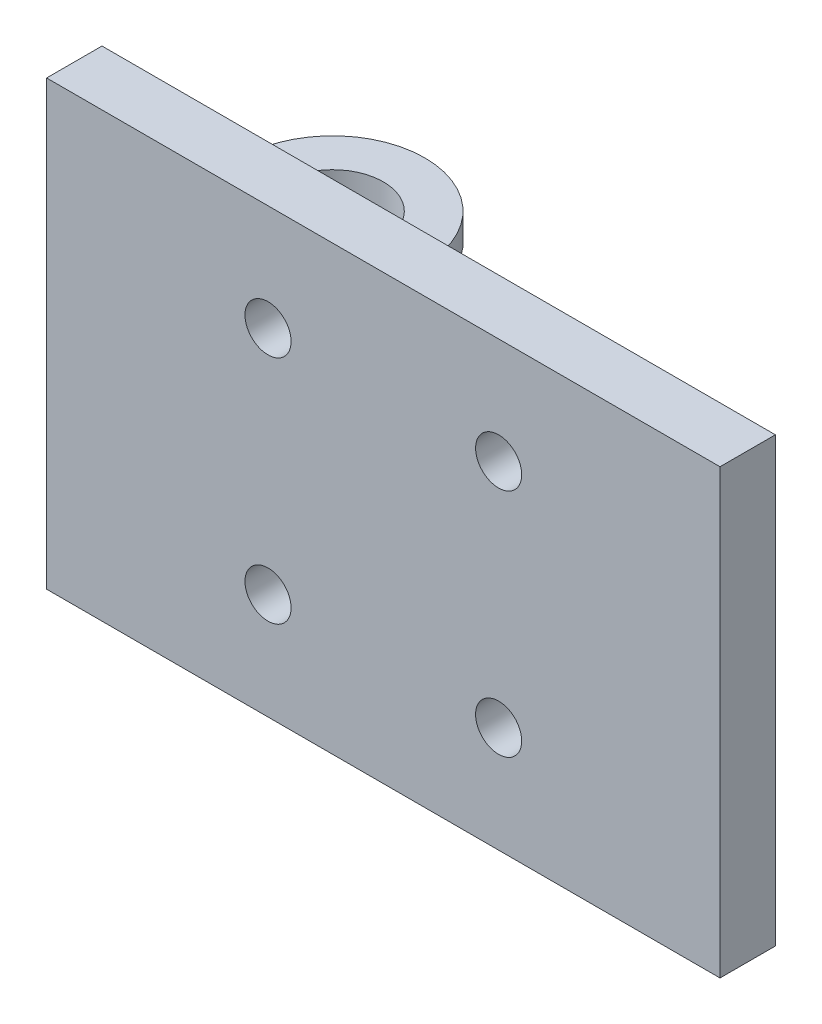
ISO-10303-21;
HEADER;
FILE_DESCRIPTION(('STEP AP214'),'2;1');
FILE_NAME('part.step','',(''),(''),'','','');
FILE_SCHEMA(('AUTOMOTIVE_DESIGN { 1 0 10303 214 1 1 1 1 }'));
ENDSEC;
DATA;
#1=APPLICATION_CONTEXT('core data for automotive mechanical design processes');
#2=APPLICATION_PROTOCOL_DEFINITION('international standard','automotive_design',2000,#1);
#3=PRODUCT_CONTEXT('',#1,'mechanical');
#4=PRODUCT('Part','Part','',(#3));
#5=PRODUCT_RELATED_PRODUCT_CATEGORY('part','',(#4));
#6=PRODUCT_DEFINITION_FORMATION('','',#4);
#7=PRODUCT_DEFINITION_CONTEXT('part definition',#1,'design');
#8=PRODUCT_DEFINITION('design','',#6,#7);
#9=PRODUCT_DEFINITION_SHAPE('','',#8);
#10=(LENGTH_UNIT() NAMED_UNIT(*) SI_UNIT(.MILLI.,.METRE.));
#11=(NAMED_UNIT(*) PLANE_ANGLE_UNIT() SI_UNIT($,.RADIAN.));
#12=(NAMED_UNIT(*) SI_UNIT($,.STERADIAN.) SOLID_ANGLE_UNIT());
#13=UNCERTAINTY_MEASURE_WITH_UNIT(LENGTH_MEASURE(1.E-05),#10,'distance_accuracy_value','');
#14=(GEOMETRIC_REPRESENTATION_CONTEXT(3) GLOBAL_UNCERTAINTY_ASSIGNED_CONTEXT((#13)) GLOBAL_UNIT_ASSIGNED_CONTEXT((#10,
#11,#12)) REPRESENTATION_CONTEXT('',''));
#15=CARTESIAN_POINT('',(0.,0.,0.));
#16=DIRECTION('',(0.,0.,1.));
#17=DIRECTION('',(1.,0.,0.));
#18=AXIS2_PLACEMENT_3D('',#15,#16,#17);
#19=CARTESIAN_POINT('',(0.,0.,1.8));
#20=DIRECTION('',(0.,0.,1.));
#21=DIRECTION('',(1.,0.,0.));
#22=AXIS2_PLACEMENT_3D('',#19,#20,#21);
#23=PLANE('',#22);
#24=CARTESIAN_POINT('',(3.75,-3.75,1.8));
#25=DIRECTION('',(0.,0.,1.));
#26=DIRECTION('',(1.,0.,0.));
#27=AXIS2_PLACEMENT_3D('',#24,#25,#26);
#28=CIRCLE('',#27,0.75);
#29=CARTESIAN_POINT('',(4.5,-3.75,1.8));
#30=VERTEX_POINT('',#29);
#31=EDGE_CURVE('E152',#30,#30,#28,.T.);
#32=ORIENTED_EDGE('',*,*,#31,.F.);
#33=EDGE_LOOP('',(#32));
#34=FACE_BOUND('',#33,.T.);
#35=CARTESIAN_POINT('',(-3.75,3.75,1.8));
#36=DIRECTION('',(0.,0.,1.));
#37=DIRECTION('',(1.,0.,0.));
#38=AXIS2_PLACEMENT_3D('',#35,#36,#37);
#39=CIRCLE('',#38,0.75);
#40=CARTESIAN_POINT('',(-3.,3.75,1.8));
#41=VERTEX_POINT('',#40);
#42=EDGE_CURVE('E122',#41,#41,#39,.T.);
#43=ORIENTED_EDGE('',*,*,#42,.F.);
#44=EDGE_LOOP('',(#43));
#45=FACE_BOUND('',#44,.T.);
#46=DIRECTION('',(0.,-1.,0.));
#47=VECTOR('',#46,1.);
#48=CARTESIAN_POINT('',(-10.95,-7.2,1.8));
#49=LINE('',#48,#47);
#50=CARTESIAN_POINT('',(-10.95,7.2,1.8));
#51=VERTEX_POINT('',#50);
#52=CARTESIAN_POINT('',(-10.95,-7.2,1.8));
#53=VERTEX_POINT('',#52);
#54=EDGE_CURVE('E102',#51,#53,#49,.T.);
#55=ORIENTED_EDGE('',*,*,#54,.T.);
#56=DIRECTION('',(1.,0.,0.));
#57=VECTOR('',#56,1.);
#58=CARTESIAN_POINT('',(10.95,-7.2,1.8));
#59=LINE('',#58,#57);
#60=CARTESIAN_POINT('',(10.95,-7.2,1.8));
#61=VERTEX_POINT('',#60);
#62=EDGE_CURVE('E97',#53,#61,#59,.T.);
#63=ORIENTED_EDGE('',*,*,#62,.T.);
#64=DIRECTION('',(0.,1.,0.));
#65=VECTOR('',#64,1.);
#66=CARTESIAN_POINT('',(10.95,-7.2,1.8));
#67=LINE('',#66,#65);
#68=CARTESIAN_POINT('',(10.95,7.2,1.8));
#69=VERTEX_POINT('',#68);
#70=EDGE_CURVE('E100',#61,#69,#67,.T.);
#71=ORIENTED_EDGE('',*,*,#70,.T.);
#72=DIRECTION('',(-1.,0.,0.));
#73=VECTOR('',#72,1.);
#74=CARTESIAN_POINT('',(10.95,7.2,1.8));
#75=LINE('',#74,#73);
#76=EDGE_CURVE('E67',#69,#51,#75,.T.);
#77=ORIENTED_EDGE('',*,*,#76,.T.);
#78=EDGE_LOOP('',(#55,#63,#71,#77));
#79=FACE_BOUND('',#78,.T.);
#80=CARTESIAN_POINT('',(3.75,3.75,1.8));
#81=DIRECTION('',(0.,0.,1.));
#82=DIRECTION('',(1.,0.,0.));
#83=AXIS2_PLACEMENT_3D('',#80,#81,#82);
#84=CIRCLE('',#83,0.75);
#85=CARTESIAN_POINT('',(4.5,3.75,1.8));
#86=VERTEX_POINT('',#85);
#87=EDGE_CURVE('E144',#86,#86,#84,.T.);
#88=ORIENTED_EDGE('',*,*,#87,.F.);
#89=EDGE_LOOP('',(#88));
#90=FACE_BOUND('',#89,.T.);
#91=CARTESIAN_POINT('',(-3.75,-3.75,1.8));
#92=DIRECTION('',(0.,0.,1.));
#93=DIRECTION('',(1.,0.,0.));
#94=AXIS2_PLACEMENT_3D('',#91,#92,#93);
#95=CIRCLE('',#94,0.75);
#96=CARTESIAN_POINT('',(-3.,-3.75,1.8));
#97=VERTEX_POINT('',#96);
#98=EDGE_CURVE('E160',#97,#97,#95,.T.);
#99=ORIENTED_EDGE('',*,*,#98,.F.);
#100=EDGE_LOOP('',(#99));
#101=FACE_BOUND('',#100,.T.);
#102=ADVANCED_FACE('F49',(#34,#45,#79,#90,#101),#23,.T.);
#103=CARTESIAN_POINT('',(0.,0.,0.));
#104=DIRECTION('',(0.,0.,1.));
#105=DIRECTION('',(1.,0.,0.));
#106=AXIS2_PLACEMENT_3D('',#103,#104,#105);
#107=PLANE('',#106);
#108=DIRECTION('',(0.,-1.,0.));
#109=VECTOR('',#108,1.);
#110=CARTESIAN_POINT('',(-10.95,-7.2,0.));
#111=LINE('',#110,#109);
#112=CARTESIAN_POINT('',(-10.95,7.2,0.));
#113=VERTEX_POINT('',#112);
#114=CARTESIAN_POINT('',(-10.95,-7.2,0.));
#115=VERTEX_POINT('',#114);
#116=EDGE_CURVE('E118',#113,#115,#111,.T.);
#117=ORIENTED_EDGE('',*,*,#116,.F.);
#118=DIRECTION('',(-1.,0.,0.));
#119=VECTOR('',#118,1.);
#120=CARTESIAN_POINT('',(10.95,7.2,0.));
#121=LINE('',#120,#119);
#122=CARTESIAN_POINT('',(10.95,7.2,0.));
#123=VERTEX_POINT('',#122);
#124=EDGE_CURVE('E90',#123,#113,#121,.T.);
#125=ORIENTED_EDGE('',*,*,#124,.F.);
#126=DIRECTION('',(0.,1.,0.));
#127=VECTOR('',#126,1.);
#128=CARTESIAN_POINT('',(10.95,-7.2,0.));
#129=LINE('',#128,#127);
#130=CARTESIAN_POINT('',(10.95,-7.2,0.));
#131=VERTEX_POINT('',#130);
#132=EDGE_CURVE('E84',#131,#123,#129,.T.);
#133=ORIENTED_EDGE('',*,*,#132,.F.);
#134=DIRECTION('',(1.,0.,0.));
#135=VECTOR('',#134,1.);
#136=CARTESIAN_POINT('',(10.95,-7.2,0.));
#137=LINE('',#136,#135);
#138=EDGE_CURVE('E107',#115,#131,#137,.T.);
#139=ORIENTED_EDGE('',*,*,#138,.F.);
#140=EDGE_LOOP('',(#117,#125,#133,#139));
#141=FACE_BOUND('',#140,.T.);
#142=CARTESIAN_POINT('',(-3.75,3.75,0.));
#143=DIRECTION('',(0.,0.,1.));
#144=DIRECTION('',(1.,0.,0.));
#145=AXIS2_PLACEMENT_3D('',#142,#143,#144);
#146=CIRCLE('',#145,0.75);
#147=CARTESIAN_POINT('',(-3.,3.75,0.));
#148=VERTEX_POINT('',#147);
#149=EDGE_CURVE('E140',#148,#148,#146,.T.);
#150=ORIENTED_EDGE('',*,*,#149,.T.);
#151=EDGE_LOOP('',(#150));
#152=FACE_BOUND('',#151,.T.);
#153=CARTESIAN_POINT('',(3.75,3.75,0.));
#154=DIRECTION('',(0.,0.,1.));
#155=DIRECTION('',(1.,0.,0.));
#156=AXIS2_PLACEMENT_3D('',#153,#154,#155);
#157=CIRCLE('',#156,0.75);
#158=CARTESIAN_POINT('',(4.5,3.75,0.));
#159=VERTEX_POINT('',#158);
#160=EDGE_CURVE('E148',#159,#159,#157,.T.);
#161=ORIENTED_EDGE('',*,*,#160,.T.);
#162=EDGE_LOOP('',(#161));
#163=FACE_BOUND('',#162,.T.);
#164=CARTESIAN_POINT('',(3.75,-3.75,0.));
#165=DIRECTION('',(0.,0.,1.));
#166=DIRECTION('',(1.,0.,0.));
#167=AXIS2_PLACEMENT_3D('',#164,#165,#166);
#168=CIRCLE('',#167,0.75);
#169=CARTESIAN_POINT('',(4.5,-3.75,0.));
#170=VERTEX_POINT('',#169);
#171=EDGE_CURVE('E156',#170,#170,#168,.T.);
#172=ORIENTED_EDGE('',*,*,#171,.T.);
#173=EDGE_LOOP('',(#172));
#174=FACE_BOUND('',#173,.T.);
#175=CARTESIAN_POINT('',(-3.75,-3.75,0.));
#176=DIRECTION('',(0.,0.,1.));
#177=DIRECTION('',(1.,0.,0.));
#178=AXIS2_PLACEMENT_3D('',#175,#176,#177);
#179=CIRCLE('',#178,0.75);
#180=CARTESIAN_POINT('',(-3.,-3.75,0.));
#181=VERTEX_POINT('',#180);
#182=EDGE_CURVE('E164',#181,#181,#179,.T.);
#183=ORIENTED_EDGE('',*,*,#182,.T.);
#184=EDGE_LOOP('',(#183));
#185=FACE_BOUND('',#184,.T.);
#186=ADVANCED_FACE('F135',(#141,#152,#163,#174,#185),#107,.F.);
#187=CARTESIAN_POINT('',(-10.95,-7.2,1.8));
#188=DIRECTION('',(1.,0.,0.));
#189=DIRECTION('',(0.,0.,-1.));
#190=AXIS2_PLACEMENT_3D('',#187,#188,#189);
#191=PLANE('',#190);
#192=ORIENTED_EDGE('',*,*,#116,.T.);
#193=DIRECTION('',(0.,0.,-1.));
#194=VECTOR('',#193,1.);
#195=CARTESIAN_POINT('',(-10.95,-7.2,1.8));
#196=LINE('',#195,#194);
#197=EDGE_CURVE('E12',#53,#115,#196,.T.);
#198=ORIENTED_EDGE('',*,*,#197,.F.);
#199=ORIENTED_EDGE('',*,*,#54,.F.);
#200=DIRECTION('',(0.,0.,-1.));
#201=VECTOR('',#200,1.);
#202=CARTESIAN_POINT('',(-10.95,7.2,1.8));
#203=LINE('',#202,#201);
#204=EDGE_CURVE('E114',#51,#113,#203,.T.);
#205=ORIENTED_EDGE('',*,*,#204,.T.);
#206=EDGE_LOOP('',(#192,#198,#199,#205));
#207=FACE_BOUND('',#206,.T.);
#208=ADVANCED_FACE('F51',(#207),#191,.F.);
#209=CARTESIAN_POINT('',(10.95,-7.2,1.8));
#210=DIRECTION('',(0.,1.,0.));
#211=DIRECTION('',(-1.,0.,0.));
#212=AXIS2_PLACEMENT_3D('',#209,#210,#211);
#213=PLANE('',#212);
#214=ORIENTED_EDGE('',*,*,#138,.T.);
#215=DIRECTION('',(0.,0.,-1.));
#216=VECTOR('',#215,1.);
#217=CARTESIAN_POINT('',(10.95,-7.2,1.8));
#218=LINE('',#217,#216);
#219=EDGE_CURVE('E59',#61,#131,#218,.T.);
#220=ORIENTED_EDGE('',*,*,#219,.F.);
#221=ORIENTED_EDGE('',*,*,#62,.F.);
#222=ORIENTED_EDGE('',*,*,#197,.T.);
#223=EDGE_LOOP('',(#214,#220,#221,#222));
#224=FACE_BOUND('',#223,.T.);
#225=ADVANCED_FACE('F106',(#224),#213,.F.);
#226=CARTESIAN_POINT('',(10.95,-7.2,1.8));
#227=DIRECTION('',(-1.,0.,0.));
#228=DIRECTION('',(0.,0.,1.));
#229=AXIS2_PLACEMENT_3D('',#226,#227,#228);
#230=PLANE('',#229);
#231=ORIENTED_EDGE('',*,*,#132,.T.);
#232=DIRECTION('',(0.,0.,-1.));
#233=VECTOR('',#232,1.);
#234=CARTESIAN_POINT('',(10.95,7.2,1.8));
#235=LINE('',#234,#233);
#236=EDGE_CURVE('E109',#69,#123,#235,.T.);
#237=ORIENTED_EDGE('',*,*,#236,.F.);
#238=ORIENTED_EDGE('',*,*,#70,.F.);
#239=ORIENTED_EDGE('',*,*,#219,.T.);
#240=EDGE_LOOP('',(#231,#237,#238,#239));
#241=FACE_BOUND('',#240,.T.);
#242=ADVANCED_FACE('F110',(#241),#230,.F.);
#243=CARTESIAN_POINT('',(10.95,7.2,1.8));
#244=DIRECTION('',(0.,-1.,0.));
#245=DIRECTION('',(1.,0.,0.));
#246=AXIS2_PLACEMENT_3D('',#243,#244,#245);
#247=PLANE('',#246);
#248=ORIENTED_EDGE('',*,*,#124,.T.);
#249=ORIENTED_EDGE('',*,*,#204,.F.);
#250=ORIENTED_EDGE('',*,*,#76,.F.);
#251=ORIENTED_EDGE('',*,*,#236,.T.);
#252=EDGE_LOOP('',(#248,#249,#250,#251));
#253=FACE_BOUND('',#252,.T.);
#254=ADVANCED_FACE('F132',(#253),#247,.F.);
#255=CARTESIAN_POINT('',(-3.75,3.75,1.8));
#256=DIRECTION('',(0.,0.,-1.));
#257=DIRECTION('',(-1.,0.,0.));
#258=AXIS2_PLACEMENT_3D('',#255,#256,#257);
#259=CYLINDRICAL_SURFACE('',#258,0.75);
#260=ORIENTED_EDGE('',*,*,#42,.T.);
#261=EDGE_LOOP('',(#260));
#262=FACE_BOUND('',#261,.T.);
#263=ORIENTED_EDGE('',*,*,#149,.F.);
#264=EDGE_LOOP('',(#263));
#265=FACE_BOUND('',#264,.T.);
#266=ADVANCED_FACE('F185',(#262,#265),#259,.F.);
#267=CARTESIAN_POINT('',(3.75,3.75,1.8));
#268=DIRECTION('',(0.,0.,-1.));
#269=DIRECTION('',(-1.,0.,0.));
#270=AXIS2_PLACEMENT_3D('',#267,#268,#269);
#271=CYLINDRICAL_SURFACE('',#270,0.75);
#272=ORIENTED_EDGE('',*,*,#87,.T.);
#273=EDGE_LOOP('',(#272));
#274=FACE_BOUND('',#273,.T.);
#275=ORIENTED_EDGE('',*,*,#160,.F.);
#276=EDGE_LOOP('',(#275));
#277=FACE_BOUND('',#276,.T.);
#278=ADVANCED_FACE('F231',(#274,#277),#271,.F.);
#279=CARTESIAN_POINT('',(3.75,-3.75,1.8));
#280=DIRECTION('',(0.,0.,-1.));
#281=DIRECTION('',(-1.,0.,0.));
#282=AXIS2_PLACEMENT_3D('',#279,#280,#281);
#283=CYLINDRICAL_SURFACE('',#282,0.75);
#284=ORIENTED_EDGE('',*,*,#31,.T.);
#285=EDGE_LOOP('',(#284));
#286=FACE_BOUND('',#285,.T.);
#287=ORIENTED_EDGE('',*,*,#171,.F.);
#288=EDGE_LOOP('',(#287));
#289=FACE_BOUND('',#288,.T.);
#290=ADVANCED_FACE('F239',(#286,#289),#283,.F.);
#291=CARTESIAN_POINT('',(-3.75,-3.75,1.8));
#292=DIRECTION('',(0.,0.,-1.));
#293=DIRECTION('',(-1.,0.,0.));
#294=AXIS2_PLACEMENT_3D('',#291,#292,#293);
#295=CYLINDRICAL_SURFACE('',#294,0.75);
#296=ORIENTED_EDGE('',*,*,#98,.T.);
#297=EDGE_LOOP('',(#296));
#298=FACE_BOUND('',#297,.T.);
#299=ORIENTED_EDGE('',*,*,#182,.F.);
#300=EDGE_LOOP('',(#299));
#301=FACE_BOUND('',#300,.T.);
#302=ADVANCED_FACE('F172',(#298,#301),#295,.F.);
#303=CLOSED_SHELL('',(#102,#186,#208,#225,#242,#254,#266,#278,#290,#302));
#304=MANIFOLD_SOLID_BREP('B2',#303);
#305=CARTESIAN_POINT('',(-7.95,1.8,-4.5));
#306=DIRECTION('',(0.,1.,0.));
#307=DIRECTION('',(0.,0.,1.));
#308=AXIS2_PLACEMENT_3D('',#305,#306,#307);
#309=PLANE('',#308);
#310=DIRECTION('',(0.,0.,1.));
#311=VECTOR('',#310,1.);
#312=CARTESIAN_POINT('',(-10.95,1.8,0.));
#313=LINE('',#312,#311);
#314=CARTESIAN_POINT('',(-10.95,1.8,-4.5));
#315=VERTEX_POINT('',#314);
#316=CARTESIAN_POINT('',(-10.95,1.8,0.));
#317=VERTEX_POINT('',#316);
#318=EDGE_CURVE('E337',#315,#317,#313,.T.);
#319=ORIENTED_EDGE('',*,*,#318,.T.);
#320=DIRECTION('',(1.,0.,0.));
#321=VECTOR('',#320,1.);
#322=CARTESIAN_POINT('',(-10.95,1.8,0.));
#323=LINE('',#322,#321);
#324=CARTESIAN_POINT('',(-4.95,1.8,0.));
#325=VERTEX_POINT('',#324);
#326=EDGE_CURVE('E332',#317,#325,#323,.T.);
#327=ORIENTED_EDGE('',*,*,#326,.T.);
#328=DIRECTION('',(0.,0.,-1.));
#329=VECTOR('',#328,1.);
#330=CARTESIAN_POINT('',(-4.95,1.8,0.));
#331=LINE('',#330,#329);
#332=CARTESIAN_POINT('',(-4.95,1.8,-4.5));
#333=VERTEX_POINT('',#332);
#334=EDGE_CURVE('E335',#325,#333,#331,.T.);
#335=ORIENTED_EDGE('',*,*,#334,.T.);
#336=CARTESIAN_POINT('',(-7.95,1.8,-4.5));
#337=DIRECTION('',(0.,1.,0.));
#338=DIRECTION('',(0.,0.,1.));
#339=AXIS2_PLACEMENT_3D('',#336,#337,#338);
#340=CIRCLE('',#339,3.);
#341=EDGE_CURVE('E302',#333,#315,#340,.T.);
#342=ORIENTED_EDGE('',*,*,#341,.T.);
#343=EDGE_LOOP('',(#319,#327,#335,#342));
#344=FACE_BOUND('',#343,.T.);
#345=CARTESIAN_POINT('',(-7.95,1.8,-4.5));
#346=DIRECTION('',(0.,1.,0.));
#347=DIRECTION('',(0.,0.,1.));
#348=AXIS2_PLACEMENT_3D('',#345,#346,#347);
#349=CIRCLE('',#348,1.65);
#350=CARTESIAN_POINT('',(-7.95,1.8,-2.85));
#351=VERTEX_POINT('',#350);
#352=EDGE_CURVE('E352',#351,#351,#349,.T.);
#353=ORIENTED_EDGE('',*,*,#352,.F.);
#354=EDGE_LOOP('',(#353));
#355=FACE_BOUND('',#354,.T.);
#356=ADVANCED_FACE('F285',(#344,#355),#309,.T.);
#357=CARTESIAN_POINT('',(-7.95,0.9,-4.5));
#358=DIRECTION('',(0.,1.,0.));
#359=DIRECTION('',(0.,0.,1.));
#360=AXIS2_PLACEMENT_3D('',#357,#358,#359);
#361=PLANE('',#360);
#362=DIRECTION('',(0.,0.,1.));
#363=VECTOR('',#362,1.);
#364=CARTESIAN_POINT('',(-10.95,0.9,0.));
#365=LINE('',#364,#363);
#366=CARTESIAN_POINT('',(-10.95,0.9,-4.5));
#367=VERTEX_POINT('',#366);
#368=CARTESIAN_POINT('',(-10.95,0.9,0.));
#369=VERTEX_POINT('',#368);
#370=EDGE_CURVE('E349',#367,#369,#365,.T.);
#371=ORIENTED_EDGE('',*,*,#370,.F.);
#372=CARTESIAN_POINT('',(-7.95,0.9,-4.5));
#373=DIRECTION('',(0.,1.,0.));
#374=DIRECTION('',(0.,0.,1.));
#375=AXIS2_PLACEMENT_3D('',#372,#373,#374);
#376=CIRCLE('',#375,3.);
#377=CARTESIAN_POINT('',(-4.95,0.9,-4.5));
#378=VERTEX_POINT('',#377);
#379=EDGE_CURVE('E325',#378,#367,#376,.T.);
#380=ORIENTED_EDGE('',*,*,#379,.F.);
#381=DIRECTION('',(0.,0.,-1.));
#382=VECTOR('',#381,1.);
#383=CARTESIAN_POINT('',(-4.95,0.9,0.));
#384=LINE('',#383,#382);
#385=CARTESIAN_POINT('',(-4.95,0.9,0.));
#386=VERTEX_POINT('',#385);
#387=EDGE_CURVE('E319',#386,#378,#384,.T.);
#388=ORIENTED_EDGE('',*,*,#387,.F.);
#389=DIRECTION('',(1.,0.,0.));
#390=VECTOR('',#389,1.);
#391=CARTESIAN_POINT('',(-10.95,0.9,0.));
#392=LINE('',#391,#390);
#393=EDGE_CURVE('E341',#369,#386,#392,.T.);
#394=ORIENTED_EDGE('',*,*,#393,.F.);
#395=EDGE_LOOP('',(#371,#380,#388,#394));
#396=FACE_BOUND('',#395,.T.);
#397=CARTESIAN_POINT('',(-7.95,0.9,-4.5));
#398=DIRECTION('',(0.,1.,0.));
#399=DIRECTION('',(0.,0.,1.));
#400=AXIS2_PLACEMENT_3D('',#397,#398,#399);
#401=CIRCLE('',#400,1.65);
#402=CARTESIAN_POINT('',(-7.95,0.9,-2.85));
#403=VERTEX_POINT('',#402);
#404=EDGE_CURVE('E364',#403,#403,#401,.T.);
#405=ORIENTED_EDGE('',*,*,#404,.T.);
#406=EDGE_LOOP('',(#405));
#407=FACE_BOUND('',#406,.T.);
#408=ADVANCED_FACE('F360',(#396,#407),#361,.F.);
#409=CARTESIAN_POINT('',(-10.95,1.8,0.));
#410=DIRECTION('',(1.,0.,0.));
#411=DIRECTION('',(0.,0.,-1.));
#412=AXIS2_PLACEMENT_3D('',#409,#410,#411);
#413=PLANE('',#412);
#414=ORIENTED_EDGE('',*,*,#370,.T.);
#415=DIRECTION('',(0.,-1.,0.));
#416=VECTOR('',#415,1.);
#417=CARTESIAN_POINT('',(-10.95,1.8,0.));
#418=LINE('',#417,#416);
#419=EDGE_CURVE('E47',#317,#369,#418,.T.);
#420=ORIENTED_EDGE('',*,*,#419,.F.);
#421=ORIENTED_EDGE('',*,*,#318,.F.);
#422=DIRECTION('',(0.,-1.,0.));
#423=VECTOR('',#422,1.);
#424=CARTESIAN_POINT('',(-10.95,1.8,-4.5));
#425=LINE('',#424,#423);
#426=EDGE_CURVE('E345',#315,#367,#425,.T.);
#427=ORIENTED_EDGE('',*,*,#426,.T.);
#428=EDGE_LOOP('',(#414,#420,#421,#427));
#429=FACE_BOUND('',#428,.T.);
#430=ADVANCED_FACE('F287',(#429),#413,.F.);
#431=CARTESIAN_POINT('',(-10.95,1.8,0.));
#432=DIRECTION('',(0.,0.,-1.));
#433=DIRECTION('',(-1.,0.,0.));
#434=AXIS2_PLACEMENT_3D('',#431,#432,#433);
#435=PLANE('',#434);
#436=ORIENTED_EDGE('',*,*,#393,.T.);
#437=DIRECTION('',(0.,-1.,0.));
#438=VECTOR('',#437,1.);
#439=CARTESIAN_POINT('',(-4.95,1.8,0.));
#440=LINE('',#439,#438);
#441=EDGE_CURVE('E294',#325,#386,#440,.T.);
#442=ORIENTED_EDGE('',*,*,#441,.F.);
#443=ORIENTED_EDGE('',*,*,#326,.F.);
#444=ORIENTED_EDGE('',*,*,#419,.T.);
#445=EDGE_LOOP('',(#436,#442,#443,#444));
#446=FACE_BOUND('',#445,.T.);
#447=ADVANCED_FACE('F340',(#446),#435,.F.);
#448=CARTESIAN_POINT('',(-4.95,1.8,0.));
#449=DIRECTION('',(-1.,0.,0.));
#450=DIRECTION('',(0.,0.,1.));
#451=AXIS2_PLACEMENT_3D('',#448,#449,#450);
#452=PLANE('',#451);
#453=ORIENTED_EDGE('',*,*,#387,.T.);
#454=DIRECTION('',(0.,-1.,0.));
#455=VECTOR('',#454,1.);
#456=CARTESIAN_POINT('',(-4.95,1.8,-4.5));
#457=LINE('',#456,#455);
#458=EDGE_CURVE('E342',#333,#378,#457,.T.);
#459=ORIENTED_EDGE('',*,*,#458,.F.);
#460=ORIENTED_EDGE('',*,*,#334,.F.);
#461=ORIENTED_EDGE('',*,*,#441,.T.);
#462=EDGE_LOOP('',(#453,#459,#460,#461));
#463=FACE_BOUND('',#462,.T.);
#464=ADVANCED_FACE('F343',(#463),#452,.F.);
#465=CARTESIAN_POINT('',(-7.95,1.8,-4.5));
#466=DIRECTION('',(0.,-1.,0.));
#467=DIRECTION('',(0.,0.,-1.));
#468=AXIS2_PLACEMENT_3D('',#465,#466,#467);
#469=CYLINDRICAL_SURFACE('',#468,3.);
#470=ORIENTED_EDGE('',*,*,#379,.T.);
#471=ORIENTED_EDGE('',*,*,#426,.F.);
#472=ORIENTED_EDGE('',*,*,#341,.F.);
#473=ORIENTED_EDGE('',*,*,#458,.T.);
#474=EDGE_LOOP('',(#470,#471,#472,#473));
#475=FACE_BOUND('',#474,.T.);
#476=ADVANCED_FACE('F357',(#475),#469,.T.);
#477=CARTESIAN_POINT('',(-7.95,1.8,-4.5));
#478=DIRECTION('',(0.,-1.,0.));
#479=DIRECTION('',(0.,0.,-1.));
#480=AXIS2_PLACEMENT_3D('',#477,#478,#479);
#481=CYLINDRICAL_SURFACE('',#480,1.65);
#482=ORIENTED_EDGE('',*,*,#352,.T.);
#483=EDGE_LOOP('',(#482));
#484=FACE_BOUND('',#483,.T.);
#485=ORIENTED_EDGE('',*,*,#404,.F.);
#486=EDGE_LOOP('',(#485));
#487=FACE_BOUND('',#486,.T.);
#488=ADVANCED_FACE('F370',(#484,#487),#481,.F.);
#489=CLOSED_SHELL('',(#356,#408,#430,#447,#464,#476,#488));
#490=MANIFOLD_SOLID_BREP('B6',#489);
#491=CARTESIAN_POINT('',(-7.95,-1.8,-4.5));
#492=DIRECTION('',(0.,-1.,0.));
#493=DIRECTION('',(0.,0.,1.));
#494=AXIS2_PLACEMENT_3D('',#491,#492,#493);
#495=PLANE('',#494);
#496=DIRECTION('',(0.,0.,1.));
#497=VECTOR('',#496,1.);
#498=CARTESIAN_POINT('',(-10.95,-1.8,0.));
#499=LINE('',#498,#497);
#500=CARTESIAN_POINT('',(-10.95,-1.8,-4.5));
#501=VERTEX_POINT('',#500);
#502=CARTESIAN_POINT('',(-10.95,-1.8,0.));
#503=VERTEX_POINT('',#502);
#504=EDGE_CURVE('E485',#501,#503,#499,.T.);
#505=ORIENTED_EDGE('',*,*,#504,.F.);
#506=CARTESIAN_POINT('',(-7.95,-1.8,-4.5));
#507=DIRECTION('',(0.,1.,0.));
#508=DIRECTION('',(0.,0.,1.));
#509=AXIS2_PLACEMENT_3D('',#506,#507,#508);
#510=CIRCLE('',#509,3.);
#511=CARTESIAN_POINT('',(-4.95,-1.8,-4.5));
#512=VERTEX_POINT('',#511);
#513=EDGE_CURVE('E488',#512,#501,#510,.T.);
#514=ORIENTED_EDGE('',*,*,#513,.F.);
#515=DIRECTION('',(0.,0.,-1.));
#516=VECTOR('',#515,1.);
#517=CARTESIAN_POINT('',(-4.95,-1.8,0.));
#518=LINE('',#517,#516);
#519=CARTESIAN_POINT('',(-4.95,-1.8,0.));
#520=VERTEX_POINT('',#519);
#521=EDGE_CURVE('E476',#520,#512,#518,.T.);
#522=ORIENTED_EDGE('',*,*,#521,.F.);
#523=DIRECTION('',(1.,0.,0.));
#524=VECTOR('',#523,1.);
#525=CARTESIAN_POINT('',(-10.95,-1.8,0.));
#526=LINE('',#525,#524);
#527=EDGE_CURVE('E481',#503,#520,#526,.T.);
#528=ORIENTED_EDGE('',*,*,#527,.F.);
#529=EDGE_LOOP('',(#505,#514,#522,#528));
#530=FACE_BOUND('',#529,.T.);
#531=CARTESIAN_POINT('',(-7.95,-1.8,-4.5));
#532=DIRECTION('',(0.,1.,0.));
#533=DIRECTION('',(0.,0.,1.));
#534=AXIS2_PLACEMENT_3D('',#531,#532,#533);
#535=CIRCLE('',#534,1.65);
#536=CARTESIAN_POINT('',(-7.95,-1.8,-2.85));
#537=VERTEX_POINT('',#536);
#538=EDGE_CURVE('E497',#537,#537,#535,.T.);
#539=ORIENTED_EDGE('',*,*,#538,.T.);
#540=EDGE_LOOP('',(#539));
#541=FACE_BOUND('',#540,.T.);
#542=ADVANCED_FACE('F429',(#530,#541),#495,.T.);
#543=CARTESIAN_POINT('',(-7.95,-0.9,-4.5));
#544=DIRECTION('',(0.,-1.,0.));
#545=DIRECTION('',(0.,0.,1.));
#546=AXIS2_PLACEMENT_3D('',#543,#544,#545);
#547=PLANE('',#546);
#548=DIRECTION('',(0.,0.,1.));
#549=VECTOR('',#548,1.);
#550=CARTESIAN_POINT('',(-10.95,-0.9,0.));
#551=LINE('',#550,#549);
#552=CARTESIAN_POINT('',(-10.95,-0.9,-4.5));
#553=VERTEX_POINT('',#552);
#554=CARTESIAN_POINT('',(-10.95,-0.9,0.));
#555=VERTEX_POINT('',#554);
#556=EDGE_CURVE('E493',#553,#555,#551,.T.);
#557=ORIENTED_EDGE('',*,*,#556,.T.);
#558=DIRECTION('',(1.,0.,0.));
#559=VECTOR('',#558,1.);
#560=CARTESIAN_POINT('',(-10.95,-0.9,0.));
#561=LINE('',#560,#559);
#562=CARTESIAN_POINT('',(-4.95,-0.9,0.));
#563=VERTEX_POINT('',#562);
#564=EDGE_CURVE('E496',#555,#563,#561,.T.);
#565=ORIENTED_EDGE('',*,*,#564,.T.);
#566=DIRECTION('',(0.,0.,-1.));
#567=VECTOR('',#566,1.);
#568=CARTESIAN_POINT('',(-4.95,-0.9,0.));
#569=LINE('',#568,#567);
#570=CARTESIAN_POINT('',(-4.95,-0.9,-4.5));
#571=VERTEX_POINT('',#570);
#572=EDGE_CURVE('E479',#563,#571,#569,.T.);
#573=ORIENTED_EDGE('',*,*,#572,.T.);
#574=CARTESIAN_POINT('',(-7.95,-0.9,-4.5));
#575=DIRECTION('',(0.,1.,0.));
#576=DIRECTION('',(0.,0.,1.));
#577=AXIS2_PLACEMENT_3D('',#574,#575,#576);
#578=CIRCLE('',#577,3.);
#579=EDGE_CURVE('E500',#571,#553,#578,.T.);
#580=ORIENTED_EDGE('',*,*,#579,.T.);
#581=EDGE_LOOP('',(#557,#565,#573,#580));
#582=FACE_BOUND('',#581,.T.);
#583=CARTESIAN_POINT('',(-7.95,-0.9,-4.5));
#584=DIRECTION('',(0.,1.,0.));
#585=DIRECTION('',(0.,0.,1.));
#586=AXIS2_PLACEMENT_3D('',#583,#584,#585);
#587=CIRCLE('',#586,1.65);
#588=CARTESIAN_POINT('',(-7.95,-0.9,-2.85));
#589=VERTEX_POINT('',#588);
#590=EDGE_CURVE('E505',#589,#589,#587,.T.);
#591=ORIENTED_EDGE('',*,*,#590,.F.);
#592=EDGE_LOOP('',(#591));
#593=FACE_BOUND('',#592,.T.);
#594=ADVANCED_FACE('F518',(#582,#593),#547,.F.);
#595=CARTESIAN_POINT('',(-10.95,-1.8,0.));
#596=DIRECTION('',(1.,0.,0.));
#597=DIRECTION('',(0.,0.,-1.));
#598=AXIS2_PLACEMENT_3D('',#595,#596,#597);
#599=PLANE('',#598);
#600=ORIENTED_EDGE('',*,*,#556,.F.);
#601=DIRECTION('',(0.,1.,0.));
#602=VECTOR('',#601,1.);
#603=CARTESIAN_POINT('',(-10.95,-1.8,-4.5));
#604=LINE('',#603,#602);
#605=EDGE_CURVE('E446',#501,#553,#604,.T.);
#606=ORIENTED_EDGE('',*,*,#605,.F.);
#607=ORIENTED_EDGE('',*,*,#504,.T.);
#608=DIRECTION('',(0.,1.,0.));
#609=VECTOR('',#608,1.);
#610=CARTESIAN_POINT('',(-10.95,-1.8,0.));
#611=LINE('',#610,#609);
#612=EDGE_CURVE('E283',#503,#555,#611,.T.);
#613=ORIENTED_EDGE('',*,*,#612,.T.);
#614=EDGE_LOOP('',(#600,#606,#607,#613));
#615=FACE_BOUND('',#614,.T.);
#616=ADVANCED_FACE('F431',(#615),#599,.F.);
#617=CARTESIAN_POINT('',(-10.95,-1.8,0.));
#618=DIRECTION('',(0.,0.,-1.));
#619=DIRECTION('',(-1.,0.,0.));
#620=AXIS2_PLACEMENT_3D('',#617,#618,#619);
#621=PLANE('',#620);
#622=ORIENTED_EDGE('',*,*,#564,.F.);
#623=ORIENTED_EDGE('',*,*,#612,.F.);
#624=ORIENTED_EDGE('',*,*,#527,.T.);
#625=DIRECTION('',(0.,1.,0.));
#626=VECTOR('',#625,1.);
#627=CARTESIAN_POINT('',(-4.95,-1.8,0.));
#628=LINE('',#627,#626);
#629=EDGE_CURVE('E438',#520,#563,#628,.T.);
#630=ORIENTED_EDGE('',*,*,#629,.T.);
#631=EDGE_LOOP('',(#622,#623,#624,#630));
#632=FACE_BOUND('',#631,.T.);
#633=ADVANCED_FACE('F482',(#632),#621,.F.);
#634=CARTESIAN_POINT('',(-4.95,-1.8,0.));
#635=DIRECTION('',(-1.,0.,0.));
#636=DIRECTION('',(0.,0.,1.));
#637=AXIS2_PLACEMENT_3D('',#634,#635,#636);
#638=PLANE('',#637);
#639=ORIENTED_EDGE('',*,*,#572,.F.);
#640=ORIENTED_EDGE('',*,*,#629,.F.);
#641=ORIENTED_EDGE('',*,*,#521,.T.);
#642=DIRECTION('',(0.,1.,0.));
#643=VECTOR('',#642,1.);
#644=CARTESIAN_POINT('',(-4.95,-1.8,-4.5));
#645=LINE('',#644,#643);
#646=EDGE_CURVE('E462',#512,#571,#645,.T.);
#647=ORIENTED_EDGE('',*,*,#646,.T.);
#648=EDGE_LOOP('',(#639,#640,#641,#647));
#649=FACE_BOUND('',#648,.T.);
#650=ADVANCED_FACE('F474',(#649),#638,.F.);
#651=CARTESIAN_POINT('',(-7.95,-1.8,-4.5));
#652=DIRECTION('',(0.,1.,0.));
#653=DIRECTION('',(0.,0.,-1.));
#654=AXIS2_PLACEMENT_3D('',#651,#652,#653);
#655=CYLINDRICAL_SURFACE('',#654,3.);
#656=ORIENTED_EDGE('',*,*,#579,.F.);
#657=ORIENTED_EDGE('',*,*,#646,.F.);
#658=ORIENTED_EDGE('',*,*,#513,.T.);
#659=ORIENTED_EDGE('',*,*,#605,.T.);
#660=EDGE_LOOP('',(#656,#657,#658,#659));
#661=FACE_BOUND('',#660,.T.);
#662=ADVANCED_FACE('F514',(#661),#655,.T.);
#663=CARTESIAN_POINT('',(-7.95,-1.8,-4.5));
#664=DIRECTION('',(0.,1.,0.));
#665=DIRECTION('',(0.,0.,-1.));
#666=AXIS2_PLACEMENT_3D('',#663,#664,#665);
#667=CYLINDRICAL_SURFACE('',#666,1.65);
#668=ORIENTED_EDGE('',*,*,#538,.F.);
#669=EDGE_LOOP('',(#668));
#670=FACE_BOUND('',#669,.T.);
#671=ORIENTED_EDGE('',*,*,#590,.T.);
#672=EDGE_LOOP('',(#671));
#673=FACE_BOUND('',#672,.T.);
#674=ADVANCED_FACE('F511',(#670,#673),#667,.F.);
#675=CLOSED_SHELL('',(#542,#594,#616,#633,#650,#662,#674));
#676=MANIFOLD_SOLID_BREP('B41',#675);
#677=ADVANCED_BREP_SHAPE_REPRESENTATION('',(#18,#304,#490,#676),#14);
#678=SHAPE_DEFINITION_REPRESENTATION(#9,#677);
ENDSEC;
END-ISO-10303-21;
